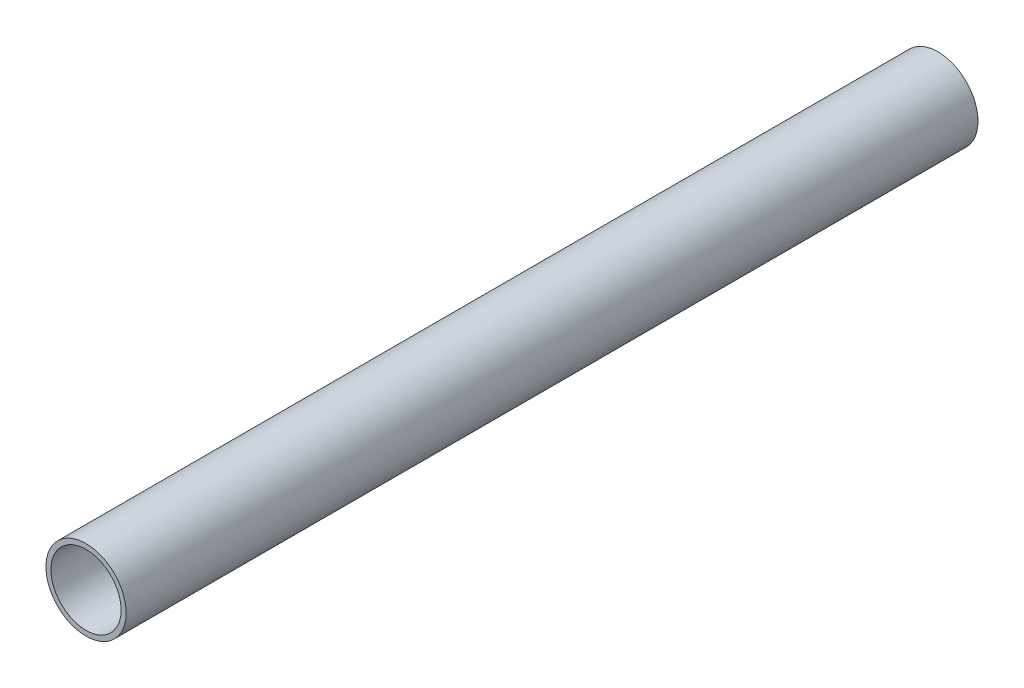
ISO-10303-21;
HEADER;
FILE_DESCRIPTION(('STEP AP214'),'2;1');
FILE_NAME('part.step','',(''),(''),'','','');
FILE_SCHEMA(('AUTOMOTIVE_DESIGN { 1 0 10303 214 1 1 1 1 }'));
ENDSEC;
DATA;
#1=APPLICATION_CONTEXT('core data for automotive mechanical design processes');
#2=APPLICATION_PROTOCOL_DEFINITION('international standard','automotive_design',2000,#1);
#3=PRODUCT_CONTEXT('',#1,'mechanical');
#4=PRODUCT('Part','Part','',(#3));
#5=PRODUCT_RELATED_PRODUCT_CATEGORY('part','',(#4));
#6=PRODUCT_DEFINITION_FORMATION('','',#4);
#7=PRODUCT_DEFINITION_CONTEXT('part definition',#1,'design');
#8=PRODUCT_DEFINITION('design','',#6,#7);
#9=PRODUCT_DEFINITION_SHAPE('','',#8);
#10=(LENGTH_UNIT() NAMED_UNIT(*) SI_UNIT(.MILLI.,.METRE.));
#11=(NAMED_UNIT(*) PLANE_ANGLE_UNIT() SI_UNIT($,.RADIAN.));
#12=(NAMED_UNIT(*) SI_UNIT($,.STERADIAN.) SOLID_ANGLE_UNIT());
#13=UNCERTAINTY_MEASURE_WITH_UNIT(LENGTH_MEASURE(1.E-05),#10,'distance_accuracy_value','');
#14=(GEOMETRIC_REPRESENTATION_CONTEXT(3) GLOBAL_UNCERTAINTY_ASSIGNED_CONTEXT((#13)) GLOBAL_UNIT_ASSIGNED_CONTEXT((#10,
#11,#12)) REPRESENTATION_CONTEXT('',''));
#15=CARTESIAN_POINT('',(0.,0.,0.));
#16=DIRECTION('',(0.,0.,1.));
#17=DIRECTION('',(1.,0.,0.));
#18=AXIS2_PLACEMENT_3D('',#15,#16,#17);
#19=CARTESIAN_POINT('',(0.,0.,-85.));
#20=DIRECTION('',(0.,0.,1.));
#21=DIRECTION('',(1.,0.,0.));
#22=AXIS2_PLACEMENT_3D('',#19,#20,#21);
#23=CYLINDRICAL_SURFACE('',#22,7.);
#24=CARTESIAN_POINT('',(0.,0.,85.));
#25=DIRECTION('',(0.,0.,1.));
#26=DIRECTION('',(1.,0.,0.));
#27=AXIS2_PLACEMENT_3D('',#24,#25,#26);
#28=CIRCLE('',#27,7.);
#29=CARTESIAN_POINT('',(7.,0.,85.));
#30=VERTEX_POINT('',#29);
#31=EDGE_CURVE('E18',#30,#30,#28,.F.);
#32=ORIENTED_EDGE('',*,*,#31,.F.);
#33=EDGE_LOOP('',(#32));
#34=FACE_BOUND('',#33,.T.);
#35=CARTESIAN_POINT('',(0.,0.,-85.));
#36=DIRECTION('',(0.,0.,1.));
#37=DIRECTION('',(1.,0.,0.));
#38=AXIS2_PLACEMENT_3D('',#35,#36,#37);
#39=CIRCLE('',#38,7.);
#40=CARTESIAN_POINT('',(7.,0.,-85.));
#41=VERTEX_POINT('',#40);
#42=EDGE_CURVE('E27',#41,#41,#39,.F.);
#43=ORIENTED_EDGE('',*,*,#42,.T.);
#44=EDGE_LOOP('',(#43));
#45=FACE_BOUND('',#44,.T.);
#46=ADVANCED_FACE('F15',(#34,#45),#23,.F.);
#47=CARTESIAN_POINT('',(0.,0.,85.));
#48=DIRECTION('',(0.,0.,1.));
#49=DIRECTION('',(1.,0.,0.));
#50=AXIS2_PLACEMENT_3D('',#47,#48,#49);
#51=PLANE('',#50);
#52=ORIENTED_EDGE('',*,*,#31,.T.);
#53=EDGE_LOOP('',(#52));
#54=FACE_BOUND('',#53,.T.);
#55=CARTESIAN_POINT('',(0.,0.,85.));
#56=DIRECTION('',(0.,0.,1.));
#57=DIRECTION('',(1.,0.,0.));
#58=AXIS2_PLACEMENT_3D('',#55,#56,#57);
#59=CIRCLE('',#58,8.);
#60=CARTESIAN_POINT('',(8.,0.,85.));
#61=VERTEX_POINT('',#60);
#62=EDGE_CURVE('E22',#61,#61,#59,.F.);
#63=ORIENTED_EDGE('',*,*,#62,.F.);
#64=EDGE_LOOP('',(#63));
#65=FACE_BOUND('',#64,.T.);
#66=ADVANCED_FACE('F35',(#54,#65),#51,.T.);
#67=CARTESIAN_POINT('',(0.,0.,-85.));
#68=DIRECTION('',(0.,0.,1.));
#69=DIRECTION('',(1.,0.,0.));
#70=AXIS2_PLACEMENT_3D('',#67,#68,#69);
#71=PLANE('',#70);
#72=ORIENTED_EDGE('',*,*,#42,.F.);
#73=EDGE_LOOP('',(#72));
#74=FACE_BOUND('',#73,.T.);
#75=CARTESIAN_POINT('',(0.,0.,-85.));
#76=DIRECTION('',(0.,0.,1.));
#77=DIRECTION('',(1.,0.,0.));
#78=AXIS2_PLACEMENT_3D('',#75,#76,#77);
#79=CIRCLE('',#78,8.);
#80=CARTESIAN_POINT('',(8.,0.,-85.));
#81=VERTEX_POINT('',#80);
#82=EDGE_CURVE('E10',#81,#81,#79,.T.);
#83=ORIENTED_EDGE('',*,*,#82,.F.);
#84=EDGE_LOOP('',(#83));
#85=FACE_BOUND('',#84,.T.);
#86=ADVANCED_FACE('F43',(#74,#85),#71,.F.);
#87=CARTESIAN_POINT('',(0.,0.,-85.));
#88=DIRECTION('',(0.,0.,1.));
#89=DIRECTION('',(1.,0.,0.));
#90=AXIS2_PLACEMENT_3D('',#87,#88,#89);
#91=CYLINDRICAL_SURFACE('',#90,8.);
#92=ORIENTED_EDGE('',*,*,#62,.T.);
#93=EDGE_LOOP('',(#92));
#94=FACE_BOUND('',#93,.T.);
#95=ORIENTED_EDGE('',*,*,#82,.T.);
#96=EDGE_LOOP('',(#95));
#97=FACE_BOUND('',#96,.T.);
#98=ADVANCED_FACE('F44',(#94,#97),#91,.T.);
#99=CLOSED_SHELL('',(#46,#66,#86,#98));
#100=MANIFOLD_SOLID_BREP('B1',#99);
#101=ADVANCED_BREP_SHAPE_REPRESENTATION('',(#18,#100),#14);
#102=SHAPE_DEFINITION_REPRESENTATION(#9,#101);
ENDSEC;
END-ISO-10303-21;
